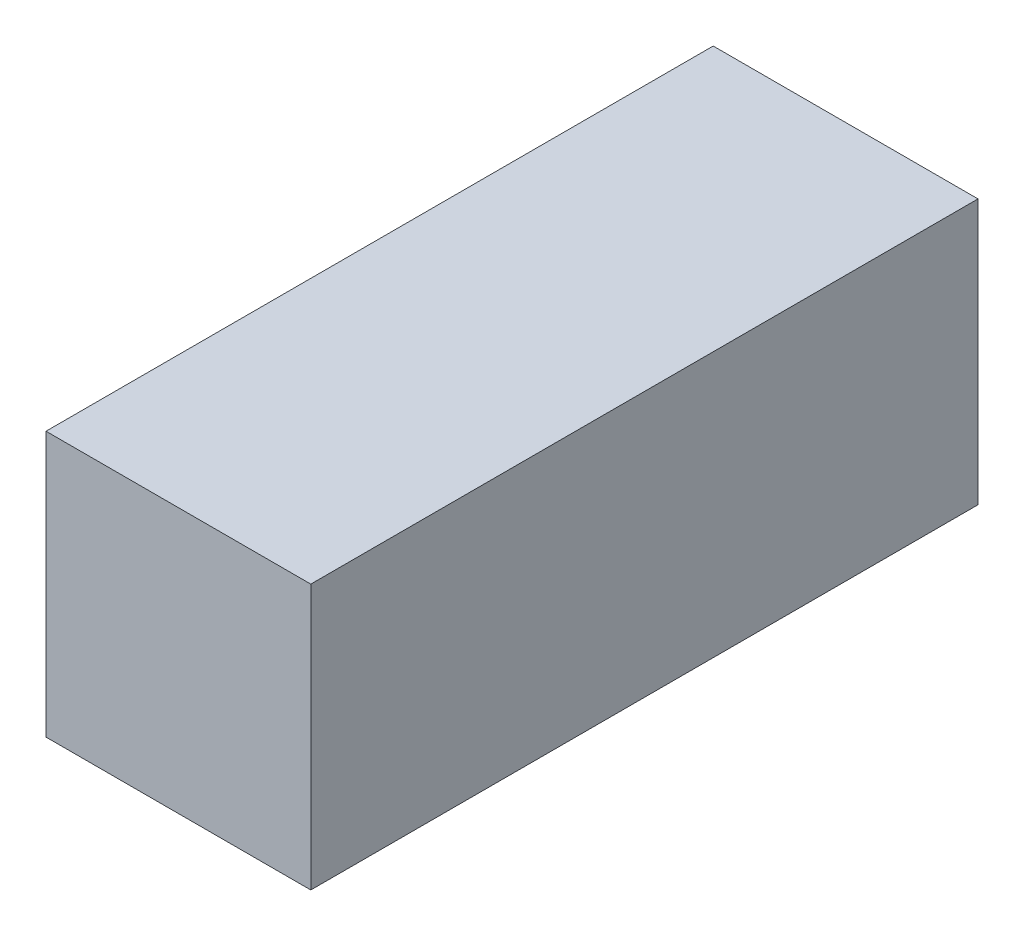
ISO-10303-21;
HEADER;
FILE_DESCRIPTION(('STEP AP214'),'2;1');
FILE_NAME('part.step','',(''),(''),'','','');
FILE_SCHEMA(('AUTOMOTIVE_DESIGN { 1 0 10303 214 1 1 1 1 }'));
ENDSEC;
DATA;
#1=APPLICATION_CONTEXT('core data for automotive mechanical design processes');
#2=APPLICATION_PROTOCOL_DEFINITION('international standard','automotive_design',2000,#1);
#3=PRODUCT_CONTEXT('',#1,'mechanical');
#4=PRODUCT('Part','Part','',(#3));
#5=PRODUCT_RELATED_PRODUCT_CATEGORY('part','',(#4));
#6=PRODUCT_DEFINITION_FORMATION('','',#4);
#7=PRODUCT_DEFINITION_CONTEXT('part definition',#1,'design');
#8=PRODUCT_DEFINITION('design','',#6,#7);
#9=PRODUCT_DEFINITION_SHAPE('','',#8);
#10=(LENGTH_UNIT() NAMED_UNIT(*) SI_UNIT(.MILLI.,.METRE.));
#11=(NAMED_UNIT(*) PLANE_ANGLE_UNIT() SI_UNIT($,.RADIAN.));
#12=(NAMED_UNIT(*) SI_UNIT($,.STERADIAN.) SOLID_ANGLE_UNIT());
#13=UNCERTAINTY_MEASURE_WITH_UNIT(LENGTH_MEASURE(1.E-05),#10,'distance_accuracy_value','');
#14=(GEOMETRIC_REPRESENTATION_CONTEXT(3) GLOBAL_UNCERTAINTY_ASSIGNED_CONTEXT((#13)) GLOBAL_UNIT_ASSIGNED_CONTEXT((#10,
#11,#12)) REPRESENTATION_CONTEXT('',''));
#15=CARTESIAN_POINT('',(0.,0.,0.));
#16=DIRECTION('',(0.,0.,1.));
#17=DIRECTION('',(1.,0.,0.));
#18=AXIS2_PLACEMENT_3D('',#15,#16,#17);
#19=CARTESIAN_POINT('',(-9.243,-5.59334053551828,-21.));
#20=DIRECTION('',(1.,0.,0.));
#21=DIRECTION('',(0.,0.,-1.));
#22=AXIS2_PLACEMENT_3D('',#19,#20,#21);
#23=PLANE('',#22);
#24=DIRECTION('',(0.,-1.,0.));
#25=VECTOR('',#24,1.);
#26=CARTESIAN_POINT('',(-9.243,-5.59334053551828,-22.6));
#27=LINE('',#26,#25);
#28=CARTESIAN_POINT('',(-9.243,-5.59334053551828,-22.6));
#29=VERTEX_POINT('',#28);
#30=CARTESIAN_POINT('',(-9.243,-6.22862876205189,-22.6));
#31=VERTEX_POINT('',#30);
#32=EDGE_CURVE('E11',#29,#31,#27,.T.);
#33=ORIENTED_EDGE('',*,*,#32,.T.);
#34=DIRECTION('',(0.,0.,-1.));
#35=VECTOR('',#34,1.);
#36=CARTESIAN_POINT('',(-9.243,-6.22862876205189,-21.));
#37=LINE('',#36,#35);
#38=CARTESIAN_POINT('',(-9.243,-6.22862876205189,-21.));
#39=VERTEX_POINT('',#38);
#40=EDGE_CURVE('E24',#39,#31,#37,.T.);
#41=ORIENTED_EDGE('',*,*,#40,.F.);
#42=DIRECTION('',(0.,-1.,0.));
#43=VECTOR('',#42,1.);
#44=CARTESIAN_POINT('',(-9.243,-5.59334053551828,-21.));
#45=LINE('',#44,#43);
#46=CARTESIAN_POINT('',(-9.243,-5.59334053551828,-21.));
#47=VERTEX_POINT('',#46);
#48=EDGE_CURVE('E88',#47,#39,#45,.T.);
#49=ORIENTED_EDGE('',*,*,#48,.F.);
#50=DIRECTION('',(0.,0.,-1.));
#51=VECTOR('',#50,1.);
#52=CARTESIAN_POINT('',(-9.243,-5.59334053551828,-21.));
#53=LINE('',#52,#51);
#54=EDGE_CURVE('E77',#47,#29,#53,.T.);
#55=ORIENTED_EDGE('',*,*,#54,.T.);
#56=EDGE_LOOP('',(#33,#41,#49,#55));
#57=FACE_BOUND('',#56,.T.);
#58=ADVANCED_FACE('F17',(#57),#23,.F.);
#59=CARTESIAN_POINT('',(-9.243,-6.22862876205189,-21.));
#60=DIRECTION('',(0.,1.,0.));
#61=DIRECTION('',(0.,0.,1.));
#62=AXIS2_PLACEMENT_3D('',#59,#60,#61);
#63=PLANE('',#62);
#64=DIRECTION('',(1.,0.,0.));
#65=VECTOR('',#64,1.);
#66=CARTESIAN_POINT('',(-9.243,-6.22862876205189,-22.6));
#67=LINE('',#66,#65);
#68=CARTESIAN_POINT('',(-8.608,-6.22862876205189,-22.6));
#69=VERTEX_POINT('',#68);
#70=EDGE_CURVE('E85',#31,#69,#67,.T.);
#71=ORIENTED_EDGE('',*,*,#70,.T.);
#72=DIRECTION('',(0.,0.,-1.));
#73=VECTOR('',#72,1.);
#74=CARTESIAN_POINT('',(-8.608,-6.22862876205189,-21.));
#75=LINE('',#74,#73);
#76=CARTESIAN_POINT('',(-8.608,-6.22862876205189,-21.));
#77=VERTEX_POINT('',#76);
#78=EDGE_CURVE('E83',#77,#69,#75,.T.);
#79=ORIENTED_EDGE('',*,*,#78,.F.);
#80=DIRECTION('',(1.,0.,0.));
#81=VECTOR('',#80,1.);
#82=CARTESIAN_POINT('',(-9.243,-6.22862876205189,-21.));
#83=LINE('',#82,#81);
#84=EDGE_CURVE('E72',#39,#77,#83,.T.);
#85=ORIENTED_EDGE('',*,*,#84,.F.);
#86=ORIENTED_EDGE('',*,*,#40,.T.);
#87=EDGE_LOOP('',(#71,#79,#85,#86));
#88=FACE_BOUND('',#87,.T.);
#89=ADVANCED_FACE('F90',(#88),#63,.F.);
#90=CARTESIAN_POINT('',(-8.608,-5.59334053551828,-21.));
#91=DIRECTION('',(-1.,0.,0.));
#92=DIRECTION('',(0.,0.,1.));
#93=AXIS2_PLACEMENT_3D('',#90,#91,#92);
#94=PLANE('',#93);
#95=DIRECTION('',(0.,1.,0.));
#96=VECTOR('',#95,1.);
#97=CARTESIAN_POINT('',(-8.608,-5.59334053551828,-22.6));
#98=LINE('',#97,#96);
#99=CARTESIAN_POINT('',(-8.608,-5.59334053551828,-22.6));
#100=VERTEX_POINT('',#99);
#101=EDGE_CURVE('E60',#69,#100,#98,.T.);
#102=ORIENTED_EDGE('',*,*,#101,.T.);
#103=DIRECTION('',(0.,0.,-1.));
#104=VECTOR('',#103,1.);
#105=CARTESIAN_POINT('',(-8.608,-5.59334053551828,-21.));
#106=LINE('',#105,#104);
#107=CARTESIAN_POINT('',(-8.608,-5.59334053551828,-21.));
#108=VERTEX_POINT('',#107);
#109=EDGE_CURVE('E54',#108,#100,#106,.T.);
#110=ORIENTED_EDGE('',*,*,#109,.F.);
#111=DIRECTION('',(0.,1.,0.));
#112=VECTOR('',#111,1.);
#113=CARTESIAN_POINT('',(-8.608,-5.59334053551828,-21.));
#114=LINE('',#113,#112);
#115=EDGE_CURVE('E58',#77,#108,#114,.T.);
#116=ORIENTED_EDGE('',*,*,#115,.F.);
#117=ORIENTED_EDGE('',*,*,#78,.T.);
#118=EDGE_LOOP('',(#102,#110,#116,#117));
#119=FACE_BOUND('',#118,.T.);
#120=ADVANCED_FACE('F56',(#119),#94,.F.);
#121=CARTESIAN_POINT('',(-9.243,-5.59334053551828,-21.));
#122=DIRECTION('',(0.,-1.,0.));
#123=DIRECTION('',(0.,0.,-1.));
#124=AXIS2_PLACEMENT_3D('',#121,#122,#123);
#125=PLANE('',#124);
#126=DIRECTION('',(-1.,0.,0.));
#127=VECTOR('',#126,1.);
#128=CARTESIAN_POINT('',(-9.243,-5.59334053551828,-22.6));
#129=LINE('',#128,#127);
#130=EDGE_CURVE('E73',#100,#29,#129,.T.);
#131=ORIENTED_EDGE('',*,*,#130,.T.);
#132=ORIENTED_EDGE('',*,*,#54,.F.);
#133=DIRECTION('',(-1.,0.,0.));
#134=VECTOR('',#133,1.);
#135=CARTESIAN_POINT('',(-9.243,-5.59334053551828,-21.));
#136=LINE('',#135,#134);
#137=EDGE_CURVE('E70',#108,#47,#136,.T.);
#138=ORIENTED_EDGE('',*,*,#137,.F.);
#139=ORIENTED_EDGE('',*,*,#109,.T.);
#140=EDGE_LOOP('',(#131,#132,#138,#139));
#141=FACE_BOUND('',#140,.T.);
#142=ADVANCED_FACE('F76',(#141),#125,.F.);
#143=CARTESIAN_POINT('',(0.,0.,-21.));
#144=DIRECTION('',(0.,0.,1.));
#145=DIRECTION('',(1.,0.,0.));
#146=AXIS2_PLACEMENT_3D('',#143,#144,#145);
#147=PLANE('',#146);
#148=ORIENTED_EDGE('',*,*,#48,.T.);
#149=ORIENTED_EDGE('',*,*,#84,.T.);
#150=ORIENTED_EDGE('',*,*,#115,.T.);
#151=ORIENTED_EDGE('',*,*,#137,.T.);
#152=EDGE_LOOP('',(#148,#149,#150,#151));
#153=FACE_BOUND('',#152,.T.);
#154=ADVANCED_FACE('F69',(#153),#147,.T.);
#155=CARTESIAN_POINT('',(0.,0.,-22.6));
#156=DIRECTION('',(0.,0.,1.));
#157=DIRECTION('',(1.,0.,0.));
#158=AXIS2_PLACEMENT_3D('',#155,#156,#157);
#159=PLANE('',#158);
#160=ORIENTED_EDGE('',*,*,#32,.F.);
#161=ORIENTED_EDGE('',*,*,#130,.F.);
#162=ORIENTED_EDGE('',*,*,#101,.F.);
#163=ORIENTED_EDGE('',*,*,#70,.F.);
#164=EDGE_LOOP('',(#160,#161,#162,#163));
#165=FACE_BOUND('',#164,.T.);
#166=ADVANCED_FACE('F91',(#165),#159,.F.);
#167=CLOSED_SHELL('',(#58,#89,#120,#142,#154,#166));
#168=MANIFOLD_SOLID_BREP('B1',#167);
#169=ADVANCED_BREP_SHAPE_REPRESENTATION('',(#18,#168),#14);
#170=SHAPE_DEFINITION_REPRESENTATION(#9,#169);
ENDSEC;
END-ISO-10303-21;
